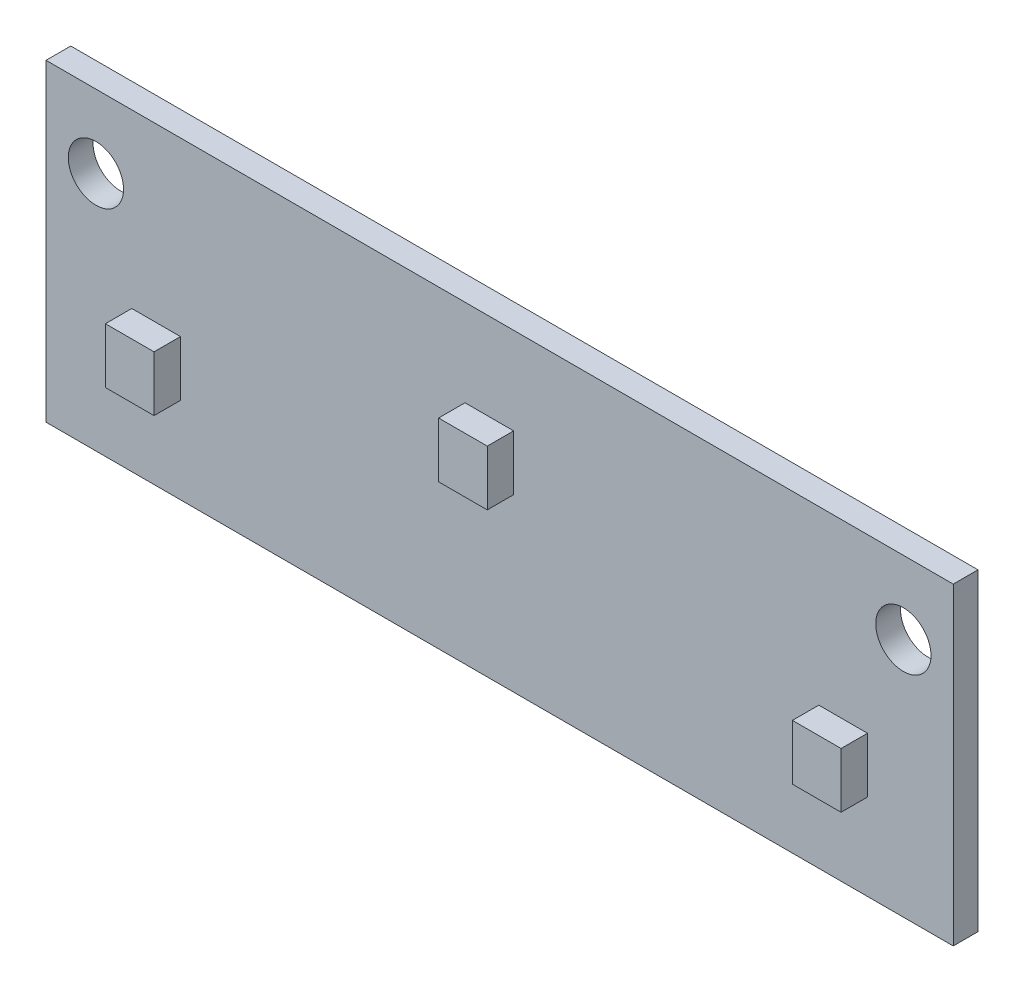
ISO-10303-21;
HEADER;
FILE_DESCRIPTION(('STEP AP214'),'2;1');
FILE_NAME('part.step','',(''),(''),'','','');
FILE_SCHEMA(('AUTOMOTIVE_DESIGN { 1 0 10303 214 1 1 1 1 }'));
ENDSEC;
DATA;
#1=APPLICATION_CONTEXT('core data for automotive mechanical design processes');
#2=APPLICATION_PROTOCOL_DEFINITION('international standard','automotive_design',2000,#1);
#3=PRODUCT_CONTEXT('',#1,'mechanical');
#4=PRODUCT('Part','Part','',(#3));
#5=PRODUCT_RELATED_PRODUCT_CATEGORY('part','',(#4));
#6=PRODUCT_DEFINITION_FORMATION('','',#4);
#7=PRODUCT_DEFINITION_CONTEXT('part definition',#1,'design');
#8=PRODUCT_DEFINITION('design','',#6,#7);
#9=PRODUCT_DEFINITION_SHAPE('','',#8);
#10=(LENGTH_UNIT() NAMED_UNIT(*) SI_UNIT(.MILLI.,.METRE.));
#11=(NAMED_UNIT(*) PLANE_ANGLE_UNIT() SI_UNIT($,.RADIAN.));
#12=(NAMED_UNIT(*) SI_UNIT($,.STERADIAN.) SOLID_ANGLE_UNIT());
#13=UNCERTAINTY_MEASURE_WITH_UNIT(LENGTH_MEASURE(1.E-05),#10,'distance_accuracy_value','');
#14=(GEOMETRIC_REPRESENTATION_CONTEXT(3) GLOBAL_UNCERTAINTY_ASSIGNED_CONTEXT((#13)) GLOBAL_UNIT_ASSIGNED_CONTEXT((#10,
#11,#12)) REPRESENTATION_CONTEXT('',''));
#15=CARTESIAN_POINT('',(0.,0.,0.));
#16=DIRECTION('',(0.,0.,1.));
#17=DIRECTION('',(1.,0.,0.));
#18=AXIS2_PLACEMENT_3D('',#15,#16,#17);
#19=CARTESIAN_POINT('',(27.5,-9.5,1.5));
#20=DIRECTION('',(-1.,0.,0.));
#21=DIRECTION('',(0.,0.,1.));
#22=AXIS2_PLACEMENT_3D('',#19,#20,#21);
#23=PLANE('',#22);
#24=DIRECTION('',(0.,1.,0.));
#25=VECTOR('',#24,1.);
#26=CARTESIAN_POINT('',(27.5,-9.5,0.));
#27=LINE('',#26,#25);
#28=CARTESIAN_POINT('',(27.5,-9.5,0.));
#29=VERTEX_POINT('',#28);
#30=CARTESIAN_POINT('',(27.5,9.5,0.));
#31=VERTEX_POINT('',#30);
#32=EDGE_CURVE('E287',#29,#31,#27,.T.);
#33=ORIENTED_EDGE('',*,*,#32,.T.);
#34=DIRECTION('',(0.,0.,-1.));
#35=VECTOR('',#34,1.);
#36=CARTESIAN_POINT('',(27.5,9.5,1.5));
#37=LINE('',#36,#35);
#38=CARTESIAN_POINT('',(27.5,9.5,1.5));
#39=VERTEX_POINT('',#38);
#40=EDGE_CURVE('E11',#39,#31,#37,.T.);
#41=ORIENTED_EDGE('',*,*,#40,.F.);
#42=DIRECTION('',(0.,1.,0.));
#43=VECTOR('',#42,1.);
#44=CARTESIAN_POINT('',(27.5,-9.5,1.5));
#45=LINE('',#44,#43);
#46=CARTESIAN_POINT('',(27.5,-9.5,1.5));
#47=VERTEX_POINT('',#46);
#48=EDGE_CURVE('E299',#47,#39,#45,.T.);
#49=ORIENTED_EDGE('',*,*,#48,.F.);
#50=DIRECTION('',(0.,0.,-1.));
#51=VECTOR('',#50,1.);
#52=CARTESIAN_POINT('',(27.5,-9.5,1.5));
#53=LINE('',#52,#51);
#54=EDGE_CURVE('E313',#47,#29,#53,.T.);
#55=ORIENTED_EDGE('',*,*,#54,.T.);
#56=EDGE_LOOP('',(#33,#41,#49,#55));
#57=FACE_BOUND('',#56,.T.);
#58=ADVANCED_FACE('F43',(#57),#23,.F.);
#59=CARTESIAN_POINT('',(-27.5,9.5,1.5));
#60=DIRECTION('',(0.,-1.,0.));
#61=DIRECTION('',(0.,0.,-1.));
#62=AXIS2_PLACEMENT_3D('',#59,#60,#61);
#63=PLANE('',#62);
#64=DIRECTION('',(-1.,0.,0.));
#65=VECTOR('',#64,1.);
#66=CARTESIAN_POINT('',(-27.5,9.5,0.));
#67=LINE('',#66,#65);
#68=CARTESIAN_POINT('',(-27.5,9.5,0.));
#69=VERTEX_POINT('',#68);
#70=EDGE_CURVE('E317',#31,#69,#67,.T.);
#71=ORIENTED_EDGE('',*,*,#70,.T.);
#72=DIRECTION('',(0.,0.,-1.));
#73=VECTOR('',#72,1.);
#74=CARTESIAN_POINT('',(-27.5,9.5,1.5));
#75=LINE('',#74,#73);
#76=CARTESIAN_POINT('',(-27.5,9.5,1.5));
#77=VERTEX_POINT('',#76);
#78=EDGE_CURVE('E51',#77,#69,#75,.T.);
#79=ORIENTED_EDGE('',*,*,#78,.F.);
#80=DIRECTION('',(-1.,0.,0.));
#81=VECTOR('',#80,1.);
#82=CARTESIAN_POINT('',(-27.5,9.5,1.5));
#83=LINE('',#82,#81);
#84=EDGE_CURVE('E303',#39,#77,#83,.T.);
#85=ORIENTED_EDGE('',*,*,#84,.F.);
#86=ORIENTED_EDGE('',*,*,#40,.T.);
#87=EDGE_LOOP('',(#71,#79,#85,#86));
#88=FACE_BOUND('',#87,.T.);
#89=ADVANCED_FACE('F352',(#88),#63,.F.);
#90=CARTESIAN_POINT('',(-27.5,-9.5,1.5));
#91=DIRECTION('',(1.,0.,0.));
#92=DIRECTION('',(0.,0.,-1.));
#93=AXIS2_PLACEMENT_3D('',#90,#91,#92);
#94=PLANE('',#93);
#95=DIRECTION('',(0.,-1.,0.));
#96=VECTOR('',#95,1.);
#97=CARTESIAN_POINT('',(-27.5,-9.5,0.));
#98=LINE('',#97,#96);
#99=CARTESIAN_POINT('',(-27.5,-9.5,0.));
#100=VERTEX_POINT('',#99);
#101=EDGE_CURVE('E320',#69,#100,#98,.T.);
#102=ORIENTED_EDGE('',*,*,#101,.T.);
#103=DIRECTION('',(0.,0.,-1.));
#104=VECTOR('',#103,1.);
#105=CARTESIAN_POINT('',(-27.5,-9.5,1.5));
#106=LINE('',#105,#104);
#107=CARTESIAN_POINT('',(-27.5,-9.5,1.5));
#108=VERTEX_POINT('',#107);
#109=EDGE_CURVE('E328',#108,#100,#106,.T.);
#110=ORIENTED_EDGE('',*,*,#109,.F.);
#111=DIRECTION('',(0.,-1.,0.));
#112=VECTOR('',#111,1.);
#113=CARTESIAN_POINT('',(-27.5,-9.5,1.5));
#114=LINE('',#113,#112);
#115=EDGE_CURVE('E307',#77,#108,#114,.T.);
#116=ORIENTED_EDGE('',*,*,#115,.F.);
#117=ORIENTED_EDGE('',*,*,#78,.T.);
#118=EDGE_LOOP('',(#102,#110,#116,#117));
#119=FACE_BOUND('',#118,.T.);
#120=ADVANCED_FACE('F337',(#119),#94,.F.);
#121=CARTESIAN_POINT('',(-27.5,-9.5,1.5));
#122=DIRECTION('',(0.,1.,0.));
#123=DIRECTION('',(0.,0.,1.));
#124=AXIS2_PLACEMENT_3D('',#121,#122,#123);
#125=PLANE('',#124);
#126=DIRECTION('',(1.,0.,0.));
#127=VECTOR('',#126,1.);
#128=CARTESIAN_POINT('',(-27.5,-9.5,0.));
#129=LINE('',#128,#127);
#130=EDGE_CURVE('E304',#100,#29,#129,.T.);
#131=ORIENTED_EDGE('',*,*,#130,.T.);
#132=ORIENTED_EDGE('',*,*,#54,.F.);
#133=DIRECTION('',(1.,0.,0.));
#134=VECTOR('',#133,1.);
#135=CARTESIAN_POINT('',(-27.5,-9.5,1.5));
#136=LINE('',#135,#134);
#137=EDGE_CURVE('E310',#108,#47,#136,.T.);
#138=ORIENTED_EDGE('',*,*,#137,.F.);
#139=ORIENTED_EDGE('',*,*,#109,.T.);
#140=EDGE_LOOP('',(#131,#132,#138,#139));
#141=FACE_BOUND('',#140,.T.);
#142=ADVANCED_FACE('F346',(#141),#125,.F.);
#143=CARTESIAN_POINT('',(0.,0.,1.5));
#144=DIRECTION('',(0.,0.,-1.));
#145=DIRECTION('',(-1.,0.,0.));
#146=AXIS2_PLACEMENT_3D('',#143,#144,#145);
#147=PLANE('',#146);
#148=DIRECTION('',(0.,1.,0.));
#149=VECTOR('',#148,1.);
#150=CARTESIAN_POINT('',(19.35,-4.28,1.5));
#151=LINE('',#150,#149);
#152=CARTESIAN_POINT('',(19.35,-4.28,1.5));
#153=VERTEX_POINT('',#152);
#154=CARTESIAN_POINT('',(19.35,-0.93,1.5));
#155=VERTEX_POINT('',#154);
#156=EDGE_CURVE('E58',#153,#155,#151,.T.);
#157=ORIENTED_EDGE('',*,*,#156,.T.);
#158=DIRECTION('',(1.,0.,0.));
#159=VECTOR('',#158,1.);
#160=CARTESIAN_POINT('',(19.35,-0.93,1.5));
#161=LINE('',#160,#159);
#162=CARTESIAN_POINT('',(22.3,-0.93,1.5));
#163=VERTEX_POINT('',#162);
#164=EDGE_CURVE('E153',#155,#163,#161,.T.);
#165=ORIENTED_EDGE('',*,*,#164,.T.);
#166=DIRECTION('',(0.,1.,0.));
#167=VECTOR('',#166,1.);
#168=CARTESIAN_POINT('',(22.3,-4.28,1.5));
#169=LINE('',#168,#167);
#170=CARTESIAN_POINT('',(22.3,-4.28,1.5));
#171=VERTEX_POINT('',#170);
#172=EDGE_CURVE('E158',#171,#163,#169,.T.);
#173=ORIENTED_EDGE('',*,*,#172,.F.);
#174=DIRECTION('',(1.,0.,0.));
#175=VECTOR('',#174,1.);
#176=CARTESIAN_POINT('',(19.35,-4.28,1.5));
#177=LINE('',#176,#175);
#178=EDGE_CURVE('E63',#153,#171,#177,.T.);
#179=ORIENTED_EDGE('',*,*,#178,.F.);
#180=EDGE_LOOP('',(#157,#165,#173,#179));
#181=FACE_BOUND('',#180,.T.);
#182=DIRECTION('',(0.,1.,0.));
#183=VECTOR('',#182,1.);
#184=CARTESIAN_POINT('',(-2.1,0.87,1.5));
#185=LINE('',#184,#183);
#186=CARTESIAN_POINT('',(-2.1,0.87,1.5));
#187=VERTEX_POINT('',#186);
#188=CARTESIAN_POINT('',(-2.1,4.22,1.5));
#189=VERTEX_POINT('',#188);
#190=EDGE_CURVE('E211',#187,#189,#185,.T.);
#191=ORIENTED_EDGE('',*,*,#190,.T.);
#192=DIRECTION('',(1.,0.,0.));
#193=VECTOR('',#192,1.);
#194=CARTESIAN_POINT('',(-2.1,4.22,1.5));
#195=LINE('',#194,#193);
#196=CARTESIAN_POINT('',(0.850000000000003,4.22,1.5));
#197=VERTEX_POINT('',#196);
#198=EDGE_CURVE('E223',#189,#197,#195,.T.);
#199=ORIENTED_EDGE('',*,*,#198,.T.);
#200=DIRECTION('',(0.,1.,0.));
#201=VECTOR('',#200,1.);
#202=CARTESIAN_POINT('',(0.850000000000003,0.87,1.5));
#203=LINE('',#202,#201);
#204=CARTESIAN_POINT('',(0.850000000000003,0.87,1.5));
#205=VERTEX_POINT('',#204);
#206=EDGE_CURVE('E219',#205,#197,#203,.T.);
#207=ORIENTED_EDGE('',*,*,#206,.F.);
#208=DIRECTION('',(1.,0.,0.));
#209=VECTOR('',#208,1.);
#210=CARTESIAN_POINT('',(-2.1,0.87,1.5));
#211=LINE('',#210,#209);
#212=EDGE_CURVE('E214',#187,#205,#211,.T.);
#213=ORIENTED_EDGE('',*,*,#212,.F.);
#214=EDGE_LOOP('',(#191,#199,#207,#213));
#215=FACE_BOUND('',#214,.T.);
#216=DIRECTION('',(0.,1.,0.));
#217=VECTOR('',#216,1.);
#218=CARTESIAN_POINT('',(-22.3,-4.28,1.5));
#219=LINE('',#218,#217);
#220=CARTESIAN_POINT('',(-22.3,-4.28,1.5));
#221=VERTEX_POINT('',#220);
#222=CARTESIAN_POINT('',(-22.3,-0.93,1.5));
#223=VERTEX_POINT('',#222);
#224=EDGE_CURVE('E244',#221,#223,#219,.T.);
#225=ORIENTED_EDGE('',*,*,#224,.T.);
#226=DIRECTION('',(1.,0.,0.));
#227=VECTOR('',#226,1.);
#228=CARTESIAN_POINT('',(-22.3,-0.93,1.5));
#229=LINE('',#228,#227);
#230=CARTESIAN_POINT('',(-19.35,-0.93,1.5));
#231=VERTEX_POINT('',#230);
#232=EDGE_CURVE('E226',#223,#231,#229,.T.);
#233=ORIENTED_EDGE('',*,*,#232,.T.);
#234=DIRECTION('',(0.,1.,0.));
#235=VECTOR('',#234,1.);
#236=CARTESIAN_POINT('',(-19.35,-4.28,1.5));
#237=LINE('',#236,#235);
#238=CARTESIAN_POINT('',(-19.35,-4.28,1.5));
#239=VERTEX_POINT('',#238);
#240=EDGE_CURVE('E257',#239,#231,#237,.T.);
#241=ORIENTED_EDGE('',*,*,#240,.F.);
#242=DIRECTION('',(1.,0.,0.));
#243=VECTOR('',#242,1.);
#244=CARTESIAN_POINT('',(-22.3,-4.28,1.5));
#245=LINE('',#244,#243);
#246=EDGE_CURVE('E261',#221,#239,#245,.T.);
#247=ORIENTED_EDGE('',*,*,#246,.F.);
#248=EDGE_LOOP('',(#225,#233,#241,#247));
#249=FACE_BOUND('',#248,.T.);
#250=CARTESIAN_POINT('',(-24.475,5.075,1.5));
#251=DIRECTION('',(0.,0.,1.));
#252=DIRECTION('',(1.,0.,0.));
#253=AXIS2_PLACEMENT_3D('',#250,#251,#252);
#254=CIRCLE('',#253,1.675);
#255=CARTESIAN_POINT('',(-22.8,5.075,1.5));
#256=VERTEX_POINT('',#255);
#257=EDGE_CURVE('E288',#256,#256,#254,.T.);
#258=ORIENTED_EDGE('',*,*,#257,.F.);
#259=EDGE_LOOP('',(#258));
#260=FACE_BOUND('',#259,.T.);
#261=CARTESIAN_POINT('',(24.475,5.075,1.5));
#262=DIRECTION('',(0.,0.,1.));
#263=DIRECTION('',(1.,0.,0.));
#264=AXIS2_PLACEMENT_3D('',#261,#262,#263);
#265=CIRCLE('',#264,1.675);
#266=CARTESIAN_POINT('',(26.15,5.075,1.5));
#267=VERTEX_POINT('',#266);
#268=EDGE_CURVE('E271',#267,#267,#265,.T.);
#269=ORIENTED_EDGE('',*,*,#268,.F.);
#270=EDGE_LOOP('',(#269));
#271=FACE_BOUND('',#270,.T.);
#272=ORIENTED_EDGE('',*,*,#48,.T.);
#273=ORIENTED_EDGE('',*,*,#84,.T.);
#274=ORIENTED_EDGE('',*,*,#115,.T.);
#275=ORIENTED_EDGE('',*,*,#137,.T.);
#276=EDGE_LOOP('',(#272,#273,#274,#275));
#277=FACE_BOUND('',#276,.T.);
#278=ADVANCED_FACE('F155',(#181,#215,#249,#260,#271,#277),#147,.F.);
#279=CARTESIAN_POINT('',(0.,0.,0.));
#280=DIRECTION('',(0.,0.,-1.));
#281=DIRECTION('',(-1.,0.,0.));
#282=AXIS2_PLACEMENT_3D('',#279,#280,#281);
#283=PLANE('',#282);
#284=CARTESIAN_POINT('',(-24.475,5.075,0.));
#285=DIRECTION('',(0.,0.,1.));
#286=DIRECTION('',(1.,0.,0.));
#287=AXIS2_PLACEMENT_3D('',#284,#285,#286);
#288=CIRCLE('',#287,1.675);
#289=CARTESIAN_POINT('',(-22.8,5.075,0.));
#290=VERTEX_POINT('',#289);
#291=EDGE_CURVE('E283',#290,#290,#288,.T.);
#292=ORIENTED_EDGE('',*,*,#291,.T.);
#293=EDGE_LOOP('',(#292));
#294=FACE_BOUND('',#293,.T.);
#295=CARTESIAN_POINT('',(24.475,5.075,0.));
#296=DIRECTION('',(0.,0.,1.));
#297=DIRECTION('',(1.,0.,0.));
#298=AXIS2_PLACEMENT_3D('',#295,#296,#297);
#299=CIRCLE('',#298,1.675);
#300=CARTESIAN_POINT('',(26.15,5.075,0.));
#301=VERTEX_POINT('',#300);
#302=EDGE_CURVE('E292',#301,#301,#299,.T.);
#303=ORIENTED_EDGE('',*,*,#302,.T.);
#304=EDGE_LOOP('',(#303));
#305=FACE_BOUND('',#304,.T.);
#306=ORIENTED_EDGE('',*,*,#32,.F.);
#307=ORIENTED_EDGE('',*,*,#130,.F.);
#308=ORIENTED_EDGE('',*,*,#101,.F.);
#309=ORIENTED_EDGE('',*,*,#70,.F.);
#310=EDGE_LOOP('',(#306,#307,#308,#309));
#311=FACE_BOUND('',#310,.T.);
#312=ADVANCED_FACE('F343',(#294,#305,#311),#283,.T.);
#313=CARTESIAN_POINT('',(24.475,5.075,0.));
#314=DIRECTION('',(0.,0.,1.));
#315=DIRECTION('',(1.,0.,0.));
#316=AXIS2_PLACEMENT_3D('',#313,#314,#315);
#317=CYLINDRICAL_SURFACE('',#316,1.675);
#318=ORIENTED_EDGE('',*,*,#302,.F.);
#319=EDGE_LOOP('',(#318));
#320=FACE_BOUND('',#319,.T.);
#321=ORIENTED_EDGE('',*,*,#268,.T.);
#322=EDGE_LOOP('',(#321));
#323=FACE_BOUND('',#322,.T.);
#324=ADVANCED_FACE('F364',(#320,#323),#317,.F.);
#325=CARTESIAN_POINT('',(-24.475,5.075,0.));
#326=DIRECTION('',(0.,0.,1.));
#327=DIRECTION('',(1.,0.,0.));
#328=AXIS2_PLACEMENT_3D('',#325,#326,#327);
#329=CYLINDRICAL_SURFACE('',#328,1.675);
#330=ORIENTED_EDGE('',*,*,#291,.F.);
#331=EDGE_LOOP('',(#330));
#332=FACE_BOUND('',#331,.T.);
#333=ORIENTED_EDGE('',*,*,#257,.T.);
#334=EDGE_LOOP('',(#333));
#335=FACE_BOUND('',#334,.T.);
#336=ADVANCED_FACE('F370',(#332,#335),#329,.F.);
#337=CARTESIAN_POINT('',(-22.3,-0.93,3.1));
#338=DIRECTION('',(0.,1.,0.));
#339=DIRECTION('',(0.,0.,1.));
#340=AXIS2_PLACEMENT_3D('',#337,#338,#339);
#341=PLANE('',#340);
#342=ORIENTED_EDGE('',*,*,#232,.F.);
#343=DIRECTION('',(0.,0.,-1.));
#344=VECTOR('',#343,1.);
#345=CARTESIAN_POINT('',(-22.3,-0.93,3.1));
#346=LINE('',#345,#344);
#347=CARTESIAN_POINT('',(-22.3,-0.93,3.1));
#348=VERTEX_POINT('',#347);
#349=EDGE_CURVE('E267',#348,#223,#346,.T.);
#350=ORIENTED_EDGE('',*,*,#349,.F.);
#351=DIRECTION('',(1.,0.,0.));
#352=VECTOR('',#351,1.);
#353=CARTESIAN_POINT('',(-22.3,-0.93,3.1));
#354=LINE('',#353,#352);
#355=CARTESIAN_POINT('',(-19.35,-0.93,3.1));
#356=VERTEX_POINT('',#355);
#357=EDGE_CURVE('E239',#348,#356,#354,.T.);
#358=ORIENTED_EDGE('',*,*,#357,.T.);
#359=DIRECTION('',(0.,0.,-1.));
#360=VECTOR('',#359,1.);
#361=CARTESIAN_POINT('',(-19.35,-0.93,3.1));
#362=LINE('',#361,#360);
#363=EDGE_CURVE('E254',#356,#231,#362,.T.);
#364=ORIENTED_EDGE('',*,*,#363,.T.);
#365=EDGE_LOOP('',(#342,#350,#358,#364));
#366=FACE_BOUND('',#365,.T.);
#367=ADVANCED_FACE('F374',(#366),#341,.T.);
#368=CARTESIAN_POINT('',(-22.3,-4.28,3.1));
#369=DIRECTION('',(-1.,0.,0.));
#370=DIRECTION('',(0.,0.,1.));
#371=AXIS2_PLACEMENT_3D('',#368,#369,#370);
#372=PLANE('',#371);
#373=ORIENTED_EDGE('',*,*,#224,.F.);
#374=DIRECTION('',(0.,0.,-1.));
#375=VECTOR('',#374,1.);
#376=CARTESIAN_POINT('',(-22.3,-4.28,3.1));
#377=LINE('',#376,#375);
#378=CARTESIAN_POINT('',(-22.3,-4.28,3.1));
#379=VERTEX_POINT('',#378);
#380=EDGE_CURVE('E272',#379,#221,#377,.T.);
#381=ORIENTED_EDGE('',*,*,#380,.F.);
#382=DIRECTION('',(0.,1.,0.));
#383=VECTOR('',#382,1.);
#384=CARTESIAN_POINT('',(-22.3,-4.28,3.1));
#385=LINE('',#384,#383);
#386=EDGE_CURVE('E250',#379,#348,#385,.T.);
#387=ORIENTED_EDGE('',*,*,#386,.T.);
#388=ORIENTED_EDGE('',*,*,#349,.T.);
#389=EDGE_LOOP('',(#373,#381,#387,#388));
#390=FACE_BOUND('',#389,.T.);
#391=ADVANCED_FACE('F378',(#390),#372,.T.);
#392=CARTESIAN_POINT('',(-22.3,-4.28,3.1));
#393=DIRECTION('',(0.,1.,0.));
#394=DIRECTION('',(0.,0.,1.));
#395=AXIS2_PLACEMENT_3D('',#392,#393,#394);
#396=PLANE('',#395);
#397=ORIENTED_EDGE('',*,*,#246,.T.);
#398=DIRECTION('',(0.,0.,-1.));
#399=VECTOR('',#398,1.);
#400=CARTESIAN_POINT('',(-19.35,-4.28,3.1));
#401=LINE('',#400,#399);
#402=CARTESIAN_POINT('',(-19.35,-4.28,3.1));
#403=VERTEX_POINT('',#402);
#404=EDGE_CURVE('E276',#403,#239,#401,.T.);
#405=ORIENTED_EDGE('',*,*,#404,.F.);
#406=DIRECTION('',(1.,0.,0.));
#407=VECTOR('',#406,1.);
#408=CARTESIAN_POINT('',(-22.3,-4.28,3.1));
#409=LINE('',#408,#407);
#410=EDGE_CURVE('E247',#379,#403,#409,.T.);
#411=ORIENTED_EDGE('',*,*,#410,.F.);
#412=ORIENTED_EDGE('',*,*,#380,.T.);
#413=EDGE_LOOP('',(#397,#405,#411,#412));
#414=FACE_BOUND('',#413,.T.);
#415=ADVANCED_FACE('F384',(#414),#396,.F.);
#416=CARTESIAN_POINT('',(-19.35,-4.28,3.1));
#417=DIRECTION('',(-1.,0.,0.));
#418=DIRECTION('',(0.,0.,1.));
#419=AXIS2_PLACEMENT_3D('',#416,#417,#418);
#420=PLANE('',#419);
#421=ORIENTED_EDGE('',*,*,#240,.T.);
#422=ORIENTED_EDGE('',*,*,#363,.F.);
#423=DIRECTION('',(0.,1.,0.));
#424=VECTOR('',#423,1.);
#425=CARTESIAN_POINT('',(-19.35,-4.28,3.1));
#426=LINE('',#425,#424);
#427=EDGE_CURVE('E243',#403,#356,#426,.T.);
#428=ORIENTED_EDGE('',*,*,#427,.F.);
#429=ORIENTED_EDGE('',*,*,#404,.T.);
#430=EDGE_LOOP('',(#421,#422,#428,#429));
#431=FACE_BOUND('',#430,.T.);
#432=ADVANCED_FACE('F380',(#431),#420,.F.);
#433=CARTESIAN_POINT('',(0.,0.,3.1));
#434=DIRECTION('',(0.,0.,1.));
#435=DIRECTION('',(1.,0.,0.));
#436=AXIS2_PLACEMENT_3D('',#433,#434,#435);
#437=PLANE('',#436);
#438=ORIENTED_EDGE('',*,*,#357,.F.);
#439=ORIENTED_EDGE('',*,*,#386,.F.);
#440=ORIENTED_EDGE('',*,*,#410,.T.);
#441=ORIENTED_EDGE('',*,*,#427,.T.);
#442=EDGE_LOOP('',(#438,#439,#440,#441));
#443=FACE_BOUND('',#442,.T.);
#444=ADVANCED_FACE('F383',(#443),#437,.T.);
#445=CARTESIAN_POINT('',(-2.1,4.22,3.1));
#446=DIRECTION('',(0.,1.,0.));
#447=DIRECTION('',(0.,0.,1.));
#448=AXIS2_PLACEMENT_3D('',#445,#446,#447);
#449=PLANE('',#448);
#450=ORIENTED_EDGE('',*,*,#198,.F.);
#451=DIRECTION('',(0.,0.,-1.));
#452=VECTOR('',#451,1.);
#453=CARTESIAN_POINT('',(-2.1,4.22,3.1));
#454=LINE('',#453,#452);
#455=CARTESIAN_POINT('',(-2.1,4.22,3.1));
#456=VERTEX_POINT('',#455);
#457=EDGE_CURVE('E161',#456,#189,#454,.T.);
#458=ORIENTED_EDGE('',*,*,#457,.F.);
#459=DIRECTION('',(1.,0.,0.));
#460=VECTOR('',#459,1.);
#461=CARTESIAN_POINT('',(-2.1,4.22,3.1));
#462=LINE('',#461,#460);
#463=CARTESIAN_POINT('',(0.850000000000003,4.22,3.1));
#464=VERTEX_POINT('',#463);
#465=EDGE_CURVE('E215',#456,#464,#462,.T.);
#466=ORIENTED_EDGE('',*,*,#465,.T.);
#467=DIRECTION('',(0.,0.,-1.));
#468=VECTOR('',#467,1.);
#469=CARTESIAN_POINT('',(0.850000000000003,4.22,3.1));
#470=LINE('',#469,#468);
#471=EDGE_CURVE('E195',#464,#197,#470,.T.);
#472=ORIENTED_EDGE('',*,*,#471,.T.);
#473=EDGE_LOOP('',(#450,#458,#466,#472));
#474=FACE_BOUND('',#473,.T.);
#475=ADVANCED_FACE('F394',(#474),#449,.T.);
#476=CARTESIAN_POINT('',(-2.1,0.87,3.1));
#477=DIRECTION('',(-1.,0.,0.));
#478=DIRECTION('',(0.,0.,1.));
#479=AXIS2_PLACEMENT_3D('',#476,#477,#478);
#480=PLANE('',#479);
#481=ORIENTED_EDGE('',*,*,#190,.F.);
#482=DIRECTION('',(0.,0.,-1.));
#483=VECTOR('',#482,1.);
#484=CARTESIAN_POINT('',(-2.1,0.87,3.1));
#485=LINE('',#484,#483);
#486=CARTESIAN_POINT('',(-2.1,0.87,3.1));
#487=VERTEX_POINT('',#486);
#488=EDGE_CURVE('E204',#487,#187,#485,.T.);
#489=ORIENTED_EDGE('',*,*,#488,.F.);
#490=DIRECTION('',(0.,1.,0.));
#491=VECTOR('',#490,1.);
#492=CARTESIAN_POINT('',(-2.1,0.87,3.1));
#493=LINE('',#492,#491);
#494=EDGE_CURVE('E199',#487,#456,#493,.T.);
#495=ORIENTED_EDGE('',*,*,#494,.T.);
#496=ORIENTED_EDGE('',*,*,#457,.T.);
#497=EDGE_LOOP('',(#481,#489,#495,#496));
#498=FACE_BOUND('',#497,.T.);
#499=ADVANCED_FACE('F401',(#498),#480,.T.);
#500=CARTESIAN_POINT('',(-2.1,0.87,3.1));
#501=DIRECTION('',(0.,1.,0.));
#502=DIRECTION('',(0.,0.,1.));
#503=AXIS2_PLACEMENT_3D('',#500,#501,#502);
#504=PLANE('',#503);
#505=ORIENTED_EDGE('',*,*,#212,.T.);
#506=DIRECTION('',(0.,0.,-1.));
#507=VECTOR('',#506,1.);
#508=CARTESIAN_POINT('',(0.850000000000003,0.87,3.1));
#509=LINE('',#508,#507);
#510=CARTESIAN_POINT('',(0.850000000000003,0.87,3.1));
#511=VERTEX_POINT('',#510);
#512=EDGE_CURVE('E200',#511,#205,#509,.T.);
#513=ORIENTED_EDGE('',*,*,#512,.F.);
#514=DIRECTION('',(1.,0.,0.));
#515=VECTOR('',#514,1.);
#516=CARTESIAN_POINT('',(-2.1,0.87,3.1));
#517=LINE('',#516,#515);
#518=EDGE_CURVE('E230',#487,#511,#517,.T.);
#519=ORIENTED_EDGE('',*,*,#518,.F.);
#520=ORIENTED_EDGE('',*,*,#488,.T.);
#521=EDGE_LOOP('',(#505,#513,#519,#520));
#522=FACE_BOUND('',#521,.T.);
#523=ADVANCED_FACE('F404',(#522),#504,.F.);
#524=CARTESIAN_POINT('',(0.850000000000003,0.87,3.1));
#525=DIRECTION('',(-1.,0.,0.));
#526=DIRECTION('',(0.,0.,1.));
#527=AXIS2_PLACEMENT_3D('',#524,#525,#526);
#528=PLANE('',#527);
#529=ORIENTED_EDGE('',*,*,#206,.T.);
#530=ORIENTED_EDGE('',*,*,#471,.F.);
#531=DIRECTION('',(0.,1.,0.));
#532=VECTOR('',#531,1.);
#533=CARTESIAN_POINT('',(0.850000000000003,0.87,3.1));
#534=LINE('',#533,#532);
#535=EDGE_CURVE('E233',#511,#464,#534,.T.);
#536=ORIENTED_EDGE('',*,*,#535,.F.);
#537=ORIENTED_EDGE('',*,*,#512,.T.);
#538=EDGE_LOOP('',(#529,#530,#536,#537));
#539=FACE_BOUND('',#538,.T.);
#540=ADVANCED_FACE('F399',(#539),#528,.F.);
#541=CARTESIAN_POINT('',(0.,0.,3.1));
#542=DIRECTION('',(0.,0.,1.));
#543=DIRECTION('',(1.,0.,0.));
#544=AXIS2_PLACEMENT_3D('',#541,#542,#543);
#545=PLANE('',#544);
#546=ORIENTED_EDGE('',*,*,#465,.F.);
#547=ORIENTED_EDGE('',*,*,#494,.F.);
#548=ORIENTED_EDGE('',*,*,#518,.T.);
#549=ORIENTED_EDGE('',*,*,#535,.T.);
#550=EDGE_LOOP('',(#546,#547,#548,#549));
#551=FACE_BOUND('',#550,.T.);
#552=ADVANCED_FACE('F396',(#551),#545,.T.);
#553=CARTESIAN_POINT('',(19.35,-0.93,3.1));
#554=DIRECTION('',(0.,1.,0.));
#555=DIRECTION('',(0.,0.,1.));
#556=AXIS2_PLACEMENT_3D('',#553,#554,#555);
#557=PLANE('',#556);
#558=ORIENTED_EDGE('',*,*,#164,.F.);
#559=DIRECTION('',(0.,0.,-1.));
#560=VECTOR('',#559,1.);
#561=CARTESIAN_POINT('',(19.35,-0.93,3.1));
#562=LINE('',#561,#560);
#563=CARTESIAN_POINT('',(19.35,-0.93,3.1));
#564=VERTEX_POINT('',#563);
#565=EDGE_CURVE('E616',#564,#155,#562,.T.);
#566=ORIENTED_EDGE('',*,*,#565,.F.);
#567=DIRECTION('',(1.,0.,0.));
#568=VECTOR('',#567,1.);
#569=CARTESIAN_POINT('',(19.35,-0.93,3.1));
#570=LINE('',#569,#568);
#571=CARTESIAN_POINT('',(22.3,-0.93,3.1));
#572=VERTEX_POINT('',#571);
#573=EDGE_CURVE('E168',#564,#572,#570,.T.);
#574=ORIENTED_EDGE('',*,*,#573,.T.);
#575=DIRECTION('',(0.,0.,-1.));
#576=VECTOR('',#575,1.);
#577=CARTESIAN_POINT('',(22.3,-0.93,3.1));
#578=LINE('',#577,#576);
#579=EDGE_CURVE('E165',#572,#163,#578,.T.);
#580=ORIENTED_EDGE('',*,*,#579,.T.);
#581=EDGE_LOOP('',(#558,#566,#574,#580));
#582=FACE_BOUND('',#581,.T.);
#583=ADVANCED_FACE('F166',(#582),#557,.T.);
#584=CARTESIAN_POINT('',(19.35,-4.28,3.1));
#585=DIRECTION('',(-1.,0.,0.));
#586=DIRECTION('',(0.,0.,1.));
#587=AXIS2_PLACEMENT_3D('',#584,#585,#586);
#588=PLANE('',#587);
#589=ORIENTED_EDGE('',*,*,#156,.F.);
#590=DIRECTION('',(0.,0.,-1.));
#591=VECTOR('',#590,1.);
#592=CARTESIAN_POINT('',(19.35,-4.28,3.1));
#593=LINE('',#592,#591);
#594=CARTESIAN_POINT('',(19.35,-4.28,3.1));
#595=VERTEX_POINT('',#594);
#596=EDGE_CURVE('E613',#595,#153,#593,.T.);
#597=ORIENTED_EDGE('',*,*,#596,.F.);
#598=DIRECTION('',(0.,1.,0.));
#599=VECTOR('',#598,1.);
#600=CARTESIAN_POINT('',(19.35,-4.28,3.1));
#601=LINE('',#600,#599);
#602=EDGE_CURVE('E172',#595,#564,#601,.T.);
#603=ORIENTED_EDGE('',*,*,#602,.T.);
#604=ORIENTED_EDGE('',*,*,#565,.T.);
#605=EDGE_LOOP('',(#589,#597,#603,#604));
#606=FACE_BOUND('',#605,.T.);
#607=ADVANCED_FACE('F419',(#606),#588,.T.);
#608=CARTESIAN_POINT('',(19.35,-4.28,3.1));
#609=DIRECTION('',(0.,1.,0.));
#610=DIRECTION('',(0.,0.,1.));
#611=AXIS2_PLACEMENT_3D('',#608,#609,#610);
#612=PLANE('',#611);
#613=ORIENTED_EDGE('',*,*,#178,.T.);
#614=DIRECTION('',(0.,0.,-1.));
#615=VECTOR('',#614,1.);
#616=CARTESIAN_POINT('',(22.3,-4.28,3.1));
#617=LINE('',#616,#615);
#618=CARTESIAN_POINT('',(22.3,-4.28,3.1));
#619=VERTEX_POINT('',#618);
#620=EDGE_CURVE('E173',#619,#171,#617,.T.);
#621=ORIENTED_EDGE('',*,*,#620,.F.);
#622=DIRECTION('',(1.,0.,0.));
#623=VECTOR('',#622,1.);
#624=CARTESIAN_POINT('',(19.35,-4.28,3.1));
#625=LINE('',#624,#623);
#626=EDGE_CURVE('E187',#595,#619,#625,.T.);
#627=ORIENTED_EDGE('',*,*,#626,.F.);
#628=ORIENTED_EDGE('',*,*,#596,.T.);
#629=EDGE_LOOP('',(#613,#621,#627,#628));
#630=FACE_BOUND('',#629,.T.);
#631=ADVANCED_FACE('F422',(#630),#612,.F.);
#632=CARTESIAN_POINT('',(22.3,-4.28,3.1));
#633=DIRECTION('',(-1.,0.,0.));
#634=DIRECTION('',(0.,0.,1.));
#635=AXIS2_PLACEMENT_3D('',#632,#633,#634);
#636=PLANE('',#635);
#637=ORIENTED_EDGE('',*,*,#172,.T.);
#638=ORIENTED_EDGE('',*,*,#579,.F.);
#639=DIRECTION('',(0.,1.,0.));
#640=VECTOR('',#639,1.);
#641=CARTESIAN_POINT('',(22.3,-4.28,3.1));
#642=LINE('',#641,#640);
#643=EDGE_CURVE('E190',#619,#572,#642,.T.);
#644=ORIENTED_EDGE('',*,*,#643,.F.);
#645=ORIENTED_EDGE('',*,*,#620,.T.);
#646=EDGE_LOOP('',(#637,#638,#644,#645));
#647=FACE_BOUND('',#646,.T.);
#648=ADVANCED_FACE('F176',(#647),#636,.F.);
#649=CARTESIAN_POINT('',(0.,0.,3.1));
#650=DIRECTION('',(0.,0.,1.));
#651=DIRECTION('',(1.,0.,0.));
#652=AXIS2_PLACEMENT_3D('',#649,#650,#651);
#653=PLANE('',#652);
#654=ORIENTED_EDGE('',*,*,#573,.F.);
#655=ORIENTED_EDGE('',*,*,#602,.F.);
#656=ORIENTED_EDGE('',*,*,#626,.T.);
#657=ORIENTED_EDGE('',*,*,#643,.T.);
#658=EDGE_LOOP('',(#654,#655,#656,#657));
#659=FACE_BOUND('',#658,.T.);
#660=ADVANCED_FACE('F415',(#659),#653,.T.);
#661=CLOSED_SHELL('',(#58,#89,#120,#142,#278,#312,#324,#336,#367,#391,#415,#432,#444,#475,#499,
#523,#540,#552,#583,#607,#631,#648,#660));
#662=MANIFOLD_SOLID_BREP('B2',#661);
#663=ADVANCED_BREP_SHAPE_REPRESENTATION('',(#18,#662),#14);
#664=SHAPE_DEFINITION_REPRESENTATION(#9,#663);
ENDSEC;
END-ISO-10303-21;
